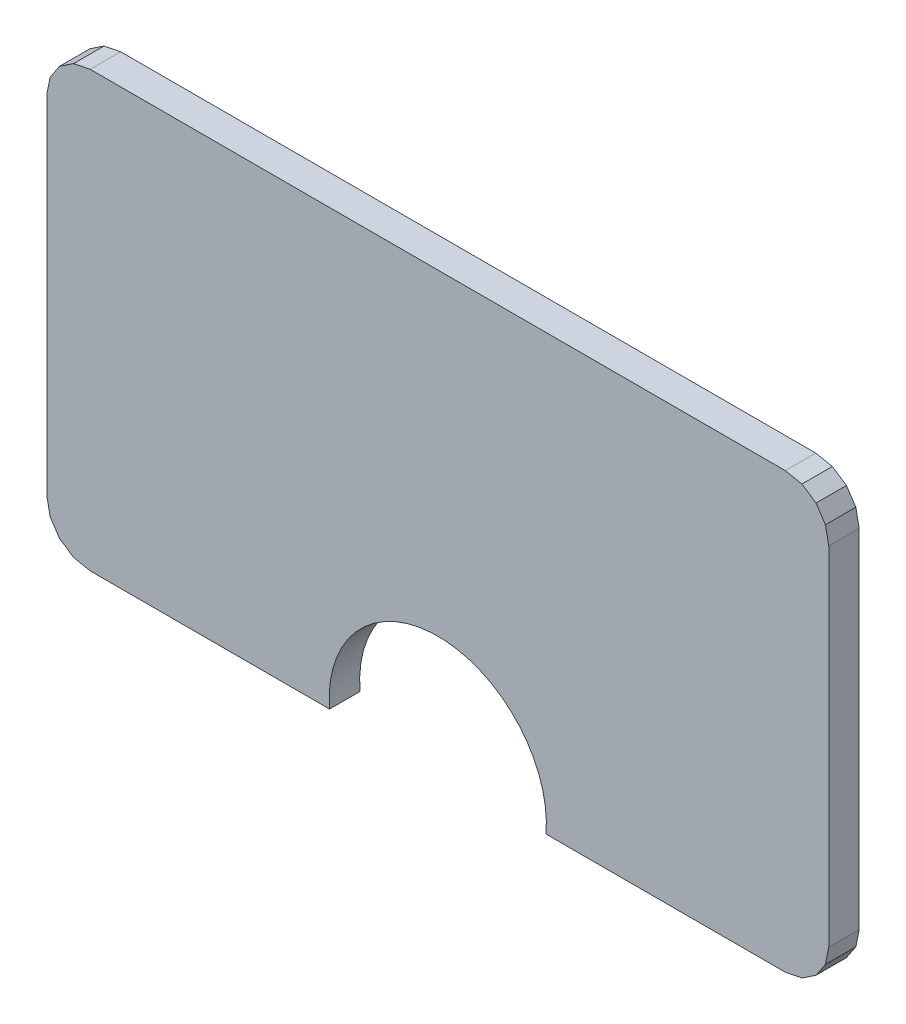
ISO-10303-21;
HEADER;
FILE_DESCRIPTION(('STEP AP214'),'2;1');
FILE_NAME('part.step','',(''),(''),'','','');
FILE_SCHEMA(('AUTOMOTIVE_DESIGN { 1 0 10303 214 1 1 1 1 }'));
ENDSEC;
DATA;
#1=APPLICATION_CONTEXT('core data for automotive mechanical design processes');
#2=APPLICATION_PROTOCOL_DEFINITION('international standard','automotive_design',2000,#1);
#3=PRODUCT_CONTEXT('',#1,'mechanical');
#4=PRODUCT('Part','Part','',(#3));
#5=PRODUCT_RELATED_PRODUCT_CATEGORY('part','',(#4));
#6=PRODUCT_DEFINITION_FORMATION('','',#4);
#7=PRODUCT_DEFINITION_CONTEXT('part definition',#1,'design');
#8=PRODUCT_DEFINITION('design','',#6,#7);
#9=PRODUCT_DEFINITION_SHAPE('','',#8);
#10=(LENGTH_UNIT() NAMED_UNIT(*) SI_UNIT(.MILLI.,.METRE.));
#11=(NAMED_UNIT(*) PLANE_ANGLE_UNIT() SI_UNIT($,.RADIAN.));
#12=(NAMED_UNIT(*) SI_UNIT($,.STERADIAN.) SOLID_ANGLE_UNIT());
#13=UNCERTAINTY_MEASURE_WITH_UNIT(LENGTH_MEASURE(1.E-05),#10,'distance_accuracy_value','');
#14=(GEOMETRIC_REPRESENTATION_CONTEXT(3) GLOBAL_UNCERTAINTY_ASSIGNED_CONTEXT((#13)) GLOBAL_UNIT_ASSIGNED_CONTEXT((#10,
#11,#12)) REPRESENTATION_CONTEXT('',''));
#15=CARTESIAN_POINT('',(0.,0.,0.));
#16=DIRECTION('',(0.,0.,1.));
#17=DIRECTION('',(1.,0.,0.));
#18=AXIS2_PLACEMENT_3D('',#15,#16,#17);
#19=CARTESIAN_POINT('',(81.68,-101.95,1.6));
#20=DIRECTION('',(1.,0.,0.));
#21=DIRECTION('',(0.,1.,0.));
#22=AXIS2_PLACEMENT_3D('',#19,#20,#21);
#23=PLANE('',#22);
#24=DIRECTION('',(0.,0.,1.));
#25=VECTOR('',#24,1.);
#26=CARTESIAN_POINT('',(81.68,-101.95,1.6));
#27=LINE('',#26,#25);
#28=CARTESIAN_POINT('',(81.68,-101.95,1.6));
#29=VERTEX_POINT('',#28);
#30=CARTESIAN_POINT('',(81.68,-101.95,1.635));
#31=VERTEX_POINT('',#30);
#32=EDGE_CURVE('E39',#29,#31,#27,.T.);
#33=ORIENTED_EDGE('',*,*,#32,.T.);
#34=DIRECTION('',(0.,-1.,0.));
#35=VECTOR('',#34,1.);
#36=CARTESIAN_POINT('',(81.68,-101.95,1.635));
#37=LINE('',#36,#35);
#38=CARTESIAN_POINT('',(81.68,-102.35,1.635));
#39=VERTEX_POINT('',#38);
#40=EDGE_CURVE('E266',#31,#39,#37,.T.);
#41=ORIENTED_EDGE('',*,*,#40,.T.);
#42=DIRECTION('',(0.,0.,1.));
#43=VECTOR('',#42,1.);
#44=CARTESIAN_POINT('',(81.68,-102.35,1.6));
#45=LINE('',#44,#43);
#46=CARTESIAN_POINT('',(81.68,-102.35,1.6));
#47=VERTEX_POINT('',#46);
#48=EDGE_CURVE('E11',#47,#39,#45,.T.);
#49=ORIENTED_EDGE('',*,*,#48,.F.);
#50=DIRECTION('',(0.,-1.,0.));
#51=VECTOR('',#50,1.);
#52=CARTESIAN_POINT('',(81.68,-101.95,1.6));
#53=LINE('',#52,#51);
#54=EDGE_CURVE('E400',#29,#47,#53,.T.);
#55=ORIENTED_EDGE('',*,*,#54,.F.);
#56=EDGE_LOOP('',(#33,#41,#49,#55));
#57=FACE_BOUND('',#56,.T.);
#58=ADVANCED_FACE('F17',(#57),#23,.T.);
#59=CARTESIAN_POINT('',(81.68,-102.35,1.6));
#60=DIRECTION('',(0.980785174844472,-0.195090852695094,0.));
#61=DIRECTION('',(0.,0.,-1.));
#62=AXIS2_PLACEMENT_3D('',#59,#60,#61);
#63=PLANE('',#62);
#64=ORIENTED_EDGE('',*,*,#48,.T.);
#65=DIRECTION('',(-0.195090852695094,-0.980785174844472,0.));
#66=VECTOR('',#65,1.);
#67=CARTESIAN_POINT('',(81.68,-102.35,1.635));
#68=LINE('',#67,#66);
#69=CARTESIAN_POINT('',(81.676194,-102.369134,1.635));
#70=VERTEX_POINT('',#69);
#71=EDGE_CURVE('E263',#39,#70,#68,.T.);
#72=ORIENTED_EDGE('',*,*,#71,.T.);
#73=DIRECTION('',(0.,0.,1.));
#74=VECTOR('',#73,1.);
#75=CARTESIAN_POINT('',(81.676194,-102.369134,1.6));
#76=LINE('',#75,#74);
#77=CARTESIAN_POINT('',(81.676194,-102.369134,1.6));
#78=VERTEX_POINT('',#77);
#79=EDGE_CURVE('E21',#78,#70,#76,.T.);
#80=ORIENTED_EDGE('',*,*,#79,.F.);
#81=DIRECTION('',(-0.195090852695094,-0.980785174844472,0.));
#82=VECTOR('',#81,1.);
#83=CARTESIAN_POINT('',(81.68,-102.35,1.6));
#84=LINE('',#83,#82);
#85=EDGE_CURVE('E385',#47,#78,#84,.T.);
#86=ORIENTED_EDGE('',*,*,#85,.F.);
#87=EDGE_LOOP('',(#64,#72,#80,#86));
#88=FACE_BOUND('',#87,.T.);
#89=ADVANCED_FACE('F19',(#88),#63,.T.);
#90=CARTESIAN_POINT('',(81.676194,-102.369134,1.6));
#91=DIRECTION('',(0.831458381235109,-0.555587041132073,0.));
#92=DIRECTION('',(0.,0.,-1.));
#93=AXIS2_PLACEMENT_3D('',#90,#91,#92);
#94=PLANE('',#93);
#95=ORIENTED_EDGE('',*,*,#79,.T.);
#96=DIRECTION('',(-0.555587041132073,-0.831458381235109,0.));
#97=VECTOR('',#96,1.);
#98=CARTESIAN_POINT('',(81.676194,-102.369134,1.635));
#99=LINE('',#98,#97);
#100=CARTESIAN_POINT('',(81.665355,-102.385355,1.635));
#101=VERTEX_POINT('',#100);
#102=EDGE_CURVE('E267',#70,#101,#99,.T.);
#103=ORIENTED_EDGE('',*,*,#102,.T.);
#104=DIRECTION('',(0.,0.,1.));
#105=VECTOR('',#104,1.);
#106=CARTESIAN_POINT('',(81.665355,-102.385355,1.6));
#107=LINE('',#106,#105);
#108=CARTESIAN_POINT('',(81.665355,-102.385355,1.6));
#109=VERTEX_POINT('',#108);
#110=EDGE_CURVE('E334',#109,#101,#107,.T.);
#111=ORIENTED_EDGE('',*,*,#110,.F.);
#112=DIRECTION('',(-0.555587041132073,-0.831458381235109,0.));
#113=VECTOR('',#112,1.);
#114=CARTESIAN_POINT('',(81.676194,-102.369134,1.6));
#115=LINE('',#114,#113);
#116=EDGE_CURVE('E380',#78,#109,#115,.T.);
#117=ORIENTED_EDGE('',*,*,#116,.F.);
#118=EDGE_LOOP('',(#95,#103,#111,#117));
#119=FACE_BOUND('',#118,.T.);
#120=ADVANCED_FACE('F517',(#119),#94,.T.);
#121=CARTESIAN_POINT('',(81.665355,-102.385355,1.6));
#122=DIRECTION('',(0.555587041132073,-0.831458381235109,0.));
#123=DIRECTION('',(0.,0.,-1.));
#124=AXIS2_PLACEMENT_3D('',#121,#122,#123);
#125=PLANE('',#124);
#126=ORIENTED_EDGE('',*,*,#110,.T.);
#127=DIRECTION('',(-0.831458381235109,-0.555587041132073,0.));
#128=VECTOR('',#127,1.);
#129=CARTESIAN_POINT('',(81.665355,-102.385355,1.635));
#130=LINE('',#129,#128);
#131=CARTESIAN_POINT('',(81.649134,-102.396194,1.635));
#132=VERTEX_POINT('',#131);
#133=EDGE_CURVE('E317',#101,#132,#130,.T.);
#134=ORIENTED_EDGE('',*,*,#133,.T.);
#135=DIRECTION('',(0.,0.,1.));
#136=VECTOR('',#135,1.);
#137=CARTESIAN_POINT('',(81.649134,-102.396194,1.6));
#138=LINE('',#137,#136);
#139=CARTESIAN_POINT('',(81.649134,-102.396194,1.6));
#140=VERTEX_POINT('',#139);
#141=EDGE_CURVE('E336',#140,#132,#138,.T.);
#142=ORIENTED_EDGE('',*,*,#141,.F.);
#143=DIRECTION('',(-0.831458381235109,-0.555587041132073,0.));
#144=VECTOR('',#143,1.);
#145=CARTESIAN_POINT('',(81.665355,-102.385355,1.6));
#146=LINE('',#145,#144);
#147=EDGE_CURVE('E384',#109,#140,#146,.T.);
#148=ORIENTED_EDGE('',*,*,#147,.F.);
#149=EDGE_LOOP('',(#126,#134,#142,#148));
#150=FACE_BOUND('',#149,.T.);
#151=ADVANCED_FACE('F515',(#150),#125,.T.);
#152=CARTESIAN_POINT('',(81.649134,-102.396194,1.6));
#153=DIRECTION('',(0.195090852695094,-0.980785174844472,0.));
#154=DIRECTION('',(0.,0.,-1.));
#155=AXIS2_PLACEMENT_3D('',#152,#153,#154);
#156=PLANE('',#155);
#157=ORIENTED_EDGE('',*,*,#141,.T.);
#158=DIRECTION('',(-0.980785174844472,-0.195090852695094,0.));
#159=VECTOR('',#158,1.);
#160=CARTESIAN_POINT('',(81.649134,-102.396194,1.635));
#161=LINE('',#160,#159);
#162=CARTESIAN_POINT('',(81.63,-102.4,1.635));
#163=VERTEX_POINT('',#162);
#164=EDGE_CURVE('E313',#132,#163,#161,.T.);
#165=ORIENTED_EDGE('',*,*,#164,.T.);
#166=DIRECTION('',(0.,0.,1.));
#167=VECTOR('',#166,1.);
#168=CARTESIAN_POINT('',(81.63,-102.4,1.6));
#169=LINE('',#168,#167);
#170=CARTESIAN_POINT('',(81.63,-102.4,1.6));
#171=VERTEX_POINT('',#170);
#172=EDGE_CURVE('E349',#171,#163,#169,.T.);
#173=ORIENTED_EDGE('',*,*,#172,.F.);
#174=DIRECTION('',(-0.980785174844472,-0.195090852695094,0.));
#175=VECTOR('',#174,1.);
#176=CARTESIAN_POINT('',(81.649134,-102.396194,1.6));
#177=LINE('',#176,#175);
#178=EDGE_CURVE('E419',#140,#171,#177,.T.);
#179=ORIENTED_EDGE('',*,*,#178,.F.);
#180=EDGE_LOOP('',(#157,#165,#173,#179));
#181=FACE_BOUND('',#180,.T.);
#182=ADVANCED_FACE('F511',(#181),#156,.T.);
#183=CARTESIAN_POINT('',(81.63,-102.4,1.6));
#184=DIRECTION('',(0.,-1.,0.));
#185=DIRECTION('',(0.,0.,-1.));
#186=AXIS2_PLACEMENT_3D('',#183,#184,#185);
#187=PLANE('',#186);
#188=DIRECTION('',(-1.,0.,0.));
#189=VECTOR('',#188,1.);
#190=CARTESIAN_POINT('',(81.63,-102.4,1.6));
#191=LINE('',#190,#189);
#192=CARTESIAN_POINT('',(81.35459935794,-102.4,1.6));
#193=VERTEX_POINT('',#192);
#194=EDGE_CURVE('E423',#171,#193,#191,.T.);
#195=ORIENTED_EDGE('',*,*,#194,.F.);
#196=ORIENTED_EDGE('',*,*,#172,.T.);
#197=DIRECTION('',(-1.,0.,0.));
#198=VECTOR('',#197,1.);
#199=CARTESIAN_POINT('',(81.63,-102.4,1.635));
#200=LINE('',#199,#198);
#201=CARTESIAN_POINT('',(81.35459935794,-102.4,1.635));
#202=VERTEX_POINT('',#201);
#203=EDGE_CURVE('E309',#163,#202,#200,.T.);
#204=ORIENTED_EDGE('',*,*,#203,.T.);
#205=DIRECTION('',(0.,0.,-1.));
#206=VECTOR('',#205,1.);
#207=CARTESIAN_POINT('',(81.354599357944,-102.4,-0.045));
#208=LINE('',#207,#206);
#209=EDGE_CURVE('E347',#202,#193,#208,.T.);
#210=ORIENTED_EDGE('',*,*,#209,.T.);
#211=EDGE_LOOP('',(#195,#196,#204,#210));
#212=FACE_BOUND('',#211,.T.);
#213=ADVANCED_FACE('F507',(#212),#187,.T.);
#214=CARTESIAN_POINT('',(81.23,-102.39,-0.045));
#215=DIRECTION('',(0.,0.,-1.));
#216=DIRECTION('',(0.,-1.,0.));
#217=AXIS2_PLACEMENT_3D('',#214,#215,#216);
#218=CYLINDRICAL_SURFACE('',#217,0.125);
#219=ORIENTED_EDGE('',*,*,#209,.F.);
#220=CARTESIAN_POINT('',(81.23,-102.39,1.635));
#221=DIRECTION('',(0.,0.,-1.));
#222=DIRECTION('',(0.,-1.,0.));
#223=AXIS2_PLACEMENT_3D('',#220,#221,#222);
#224=CIRCLE('',#223,0.125);
#225=CARTESIAN_POINT('',(81.10540064206,-102.4,1.635));
#226=VERTEX_POINT('',#225);
#227=EDGE_CURVE('E305',#226,#202,#224,.T.);
#228=ORIENTED_EDGE('',*,*,#227,.F.);
#229=DIRECTION('',(0.,0.,-1.));
#230=VECTOR('',#229,1.);
#231=CARTESIAN_POINT('',(81.105400642056,-102.4,-0.045));
#232=LINE('',#231,#230);
#233=CARTESIAN_POINT('',(81.10540064206,-102.4,1.6));
#234=VERTEX_POINT('',#233);
#235=EDGE_CURVE('E345',#226,#234,#232,.T.);
#236=ORIENTED_EDGE('',*,*,#235,.T.);
#237=CARTESIAN_POINT('',(81.23,-102.39,1.6));
#238=DIRECTION('',(0.,0.,-1.));
#239=DIRECTION('',(0.,-1.,0.));
#240=AXIS2_PLACEMENT_3D('',#237,#238,#239);
#241=CIRCLE('',#240,0.125);
#242=EDGE_CURVE('E427',#234,#193,#241,.T.);
#243=ORIENTED_EDGE('',*,*,#242,.T.);
#244=EDGE_LOOP('',(#219,#228,#236,#243));
#245=FACE_BOUND('',#244,.T.);
#246=ADVANCED_FACE('F506',(#245),#218,.F.);
#247=CARTESIAN_POINT('',(81.63,-102.4,1.6));
#248=DIRECTION('',(0.,-1.,0.));
#249=DIRECTION('',(0.,0.,-1.));
#250=AXIS2_PLACEMENT_3D('',#247,#248,#249);
#251=PLANE('',#250);
#252=DIRECTION('',(-1.,0.,0.));
#253=VECTOR('',#252,1.);
#254=CARTESIAN_POINT('',(81.63,-102.4,1.6));
#255=LINE('',#254,#253);
#256=CARTESIAN_POINT('',(80.83,-102.4,1.6));
#257=VERTEX_POINT('',#256);
#258=EDGE_CURVE('E430',#234,#257,#255,.T.);
#259=ORIENTED_EDGE('',*,*,#258,.F.);
#260=ORIENTED_EDGE('',*,*,#235,.F.);
#261=DIRECTION('',(-1.,0.,0.));
#262=VECTOR('',#261,1.);
#263=CARTESIAN_POINT('',(81.63,-102.4,1.635));
#264=LINE('',#263,#262);
#265=CARTESIAN_POINT('',(80.83,-102.4,1.635));
#266=VERTEX_POINT('',#265);
#267=EDGE_CURVE('E301',#226,#266,#264,.T.);
#268=ORIENTED_EDGE('',*,*,#267,.T.);
#269=DIRECTION('',(0.,0.,1.));
#270=VECTOR('',#269,1.);
#271=CARTESIAN_POINT('',(80.83,-102.4,1.6));
#272=LINE('',#271,#270);
#273=EDGE_CURVE('E342',#257,#266,#272,.T.);
#274=ORIENTED_EDGE('',*,*,#273,.F.);
#275=EDGE_LOOP('',(#259,#260,#268,#274));
#276=FACE_BOUND('',#275,.T.);
#277=ADVANCED_FACE('F504',(#276),#251,.T.);
#278=CARTESIAN_POINT('',(80.83,-102.4,1.6));
#279=DIRECTION('',(-0.195090852695094,-0.980785174844472,0.));
#280=DIRECTION('',(-0.980785174844472,0.195090852695094,0.));
#281=AXIS2_PLACEMENT_3D('',#278,#279,#280);
#282=PLANE('',#281);
#283=ORIENTED_EDGE('',*,*,#273,.T.);
#284=DIRECTION('',(-0.980785174844472,0.195090852695094,0.));
#285=VECTOR('',#284,1.);
#286=CARTESIAN_POINT('',(80.83,-102.4,1.635));
#287=LINE('',#286,#285);
#288=CARTESIAN_POINT('',(80.810866,-102.396194,1.635));
#289=VERTEX_POINT('',#288);
#290=EDGE_CURVE('E297',#266,#289,#287,.T.);
#291=ORIENTED_EDGE('',*,*,#290,.T.);
#292=DIRECTION('',(0.,0.,1.));
#293=VECTOR('',#292,1.);
#294=CARTESIAN_POINT('',(80.810866,-102.396194,1.6));
#295=LINE('',#294,#293);
#296=CARTESIAN_POINT('',(80.810866,-102.396194,1.6));
#297=VERTEX_POINT('',#296);
#298=EDGE_CURVE('E346',#297,#289,#295,.T.);
#299=ORIENTED_EDGE('',*,*,#298,.F.);
#300=DIRECTION('',(-0.980785174844472,0.195090852695094,0.));
#301=VECTOR('',#300,1.);
#302=CARTESIAN_POINT('',(80.83,-102.4,1.6));
#303=LINE('',#302,#301);
#304=EDGE_CURVE('E439',#257,#297,#303,.T.);
#305=ORIENTED_EDGE('',*,*,#304,.F.);
#306=EDGE_LOOP('',(#283,#291,#299,#305));
#307=FACE_BOUND('',#306,.T.);
#308=ADVANCED_FACE('F492',(#307),#282,.T.);
#309=CARTESIAN_POINT('',(80.810866,-102.396194,1.6));
#310=DIRECTION('',(-0.555587041132073,-0.831458381235109,0.));
#311=DIRECTION('',(-0.831458381235109,0.555587041132073,0.));
#312=AXIS2_PLACEMENT_3D('',#309,#310,#311);
#313=PLANE('',#312);
#314=ORIENTED_EDGE('',*,*,#298,.T.);
#315=DIRECTION('',(-0.831458381235109,0.555587041132073,0.));
#316=VECTOR('',#315,1.);
#317=CARTESIAN_POINT('',(80.810866,-102.396194,1.635));
#318=LINE('',#317,#316);
#319=CARTESIAN_POINT('',(80.794645,-102.385355,1.635));
#320=VERTEX_POINT('',#319);
#321=EDGE_CURVE('E293',#289,#320,#318,.T.);
#322=ORIENTED_EDGE('',*,*,#321,.T.);
#323=DIRECTION('',(0.,0.,1.));
#324=VECTOR('',#323,1.);
#325=CARTESIAN_POINT('',(80.794645,-102.385355,1.6));
#326=LINE('',#325,#324);
#327=CARTESIAN_POINT('',(80.794645,-102.385355,1.6));
#328=VERTEX_POINT('',#327);
#329=EDGE_CURVE('E379',#328,#320,#326,.T.);
#330=ORIENTED_EDGE('',*,*,#329,.F.);
#331=DIRECTION('',(-0.831458381235109,0.555587041132073,0.));
#332=VECTOR('',#331,1.);
#333=CARTESIAN_POINT('',(80.810866,-102.396194,1.6));
#334=LINE('',#333,#332);
#335=EDGE_CURVE('E440',#297,#328,#334,.T.);
#336=ORIENTED_EDGE('',*,*,#335,.F.);
#337=EDGE_LOOP('',(#314,#322,#330,#336));
#338=FACE_BOUND('',#337,.T.);
#339=ADVANCED_FACE('F496',(#338),#313,.T.);
#340=CARTESIAN_POINT('',(80.794645,-102.385355,1.6));
#341=DIRECTION('',(-0.831458381235109,-0.555587041132073,0.));
#342=DIRECTION('',(-0.555587041132073,0.831458381235109,0.));
#343=AXIS2_PLACEMENT_3D('',#340,#341,#342);
#344=PLANE('',#343);
#345=ORIENTED_EDGE('',*,*,#329,.T.);
#346=DIRECTION('',(-0.555587041132073,0.831458381235109,0.));
#347=VECTOR('',#346,1.);
#348=CARTESIAN_POINT('',(80.794645,-102.385355,1.635));
#349=LINE('',#348,#347);
#350=CARTESIAN_POINT('',(80.783806,-102.369134,1.635));
#351=VERTEX_POINT('',#350);
#352=EDGE_CURVE('E289',#320,#351,#349,.T.);
#353=ORIENTED_EDGE('',*,*,#352,.T.);
#354=DIRECTION('',(0.,0.,1.));
#355=VECTOR('',#354,1.);
#356=CARTESIAN_POINT('',(80.783806,-102.369134,1.6));
#357=LINE('',#356,#355);
#358=CARTESIAN_POINT('',(80.783806,-102.369134,1.6));
#359=VERTEX_POINT('',#358);
#360=EDGE_CURVE('E341',#359,#351,#357,.T.);
#361=ORIENTED_EDGE('',*,*,#360,.F.);
#362=DIRECTION('',(-0.555587041132073,0.831458381235109,0.));
#363=VECTOR('',#362,1.);
#364=CARTESIAN_POINT('',(80.794645,-102.385355,1.6));
#365=LINE('',#364,#363);
#366=EDGE_CURVE('E444',#328,#359,#365,.T.);
#367=ORIENTED_EDGE('',*,*,#366,.F.);
#368=EDGE_LOOP('',(#345,#353,#361,#367));
#369=FACE_BOUND('',#368,.T.);
#370=ADVANCED_FACE('F499',(#369),#344,.T.);
#371=CARTESIAN_POINT('',(80.783806,-102.369134,1.6));
#372=DIRECTION('',(-0.980785174844701,-0.19509085269394,0.));
#373=DIRECTION('',(-0.19509085269394,0.980785174844701,0.));
#374=AXIS2_PLACEMENT_3D('',#371,#372,#373);
#375=PLANE('',#374);
#376=ORIENTED_EDGE('',*,*,#360,.T.);
#377=DIRECTION('',(-0.19509085269394,0.980785174844701,0.));
#378=VECTOR('',#377,1.);
#379=CARTESIAN_POINT('',(80.783806,-102.369134,1.635));
#380=LINE('',#379,#378);
#381=CARTESIAN_POINT('',(80.78,-102.35,1.635));
#382=VERTEX_POINT('',#381);
#383=EDGE_CURVE('E285',#351,#382,#380,.T.);
#384=ORIENTED_EDGE('',*,*,#383,.T.);
#385=DIRECTION('',(0.,0.,1.));
#386=VECTOR('',#385,1.);
#387=CARTESIAN_POINT('',(80.78,-102.35,1.6));
#388=LINE('',#387,#386);
#389=CARTESIAN_POINT('',(80.78,-102.35,1.6));
#390=VERTEX_POINT('',#389);
#391=EDGE_CURVE('E338',#390,#382,#388,.T.);
#392=ORIENTED_EDGE('',*,*,#391,.F.);
#393=DIRECTION('',(-0.19509085269394,0.980785174844701,0.));
#394=VECTOR('',#393,1.);
#395=CARTESIAN_POINT('',(80.783806,-102.369134,1.6));
#396=LINE('',#395,#394);
#397=EDGE_CURVE('E251',#359,#390,#396,.T.);
#398=ORIENTED_EDGE('',*,*,#397,.F.);
#399=EDGE_LOOP('',(#376,#384,#392,#398));
#400=FACE_BOUND('',#399,.T.);
#401=ADVANCED_FACE('F453',(#400),#375,.T.);
#402=CARTESIAN_POINT('',(80.78,-102.35,1.6));
#403=DIRECTION('',(-1.,0.,0.));
#404=DIRECTION('',(0.,0.,1.));
#405=AXIS2_PLACEMENT_3D('',#402,#403,#404);
#406=PLANE('',#405);
#407=ORIENTED_EDGE('',*,*,#391,.T.);
#408=DIRECTION('',(0.,1.,0.));
#409=VECTOR('',#408,1.);
#410=CARTESIAN_POINT('',(80.78,-102.35,1.635));
#411=LINE('',#410,#409);
#412=CARTESIAN_POINT('',(80.78,-101.95,1.635));
#413=VERTEX_POINT('',#412);
#414=EDGE_CURVE('E281',#382,#413,#411,.T.);
#415=ORIENTED_EDGE('',*,*,#414,.T.);
#416=DIRECTION('',(0.,0.,1.));
#417=VECTOR('',#416,1.);
#418=CARTESIAN_POINT('',(80.78,-101.95,1.6));
#419=LINE('',#418,#417);
#420=CARTESIAN_POINT('',(80.78,-101.95,1.6));
#421=VERTEX_POINT('',#420);
#422=EDGE_CURVE('E229',#421,#413,#419,.T.);
#423=ORIENTED_EDGE('',*,*,#422,.F.);
#424=DIRECTION('',(0.,1.,0.));
#425=VECTOR('',#424,1.);
#426=CARTESIAN_POINT('',(80.78,-102.35,1.6));
#427=LINE('',#426,#425);
#428=EDGE_CURVE('E244',#390,#421,#427,.T.);
#429=ORIENTED_EDGE('',*,*,#428,.F.);
#430=EDGE_LOOP('',(#407,#415,#423,#429));
#431=FACE_BOUND('',#430,.T.);
#432=ADVANCED_FACE('F457',(#431),#406,.T.);
#433=CARTESIAN_POINT('',(80.78,-101.95,1.6));
#434=DIRECTION('',(-0.980785174844701,0.19509085269394,0.));
#435=DIRECTION('',(0.,0.,1.));
#436=AXIS2_PLACEMENT_3D('',#433,#434,#435);
#437=PLANE('',#436);
#438=ORIENTED_EDGE('',*,*,#422,.T.);
#439=DIRECTION('',(0.19509085269394,0.980785174844701,0.));
#440=VECTOR('',#439,1.);
#441=CARTESIAN_POINT('',(80.78,-101.95,1.635));
#442=LINE('',#441,#440);
#443=CARTESIAN_POINT('',(80.783806,-101.930866,1.635));
#444=VERTEX_POINT('',#443);
#445=EDGE_CURVE('E224',#413,#444,#442,.T.);
#446=ORIENTED_EDGE('',*,*,#445,.T.);
#447=DIRECTION('',(0.,0.,1.));
#448=VECTOR('',#447,1.);
#449=CARTESIAN_POINT('',(80.783806,-101.930866,1.6));
#450=LINE('',#449,#448);
#451=CARTESIAN_POINT('',(80.783806,-101.930866,1.6));
#452=VERTEX_POINT('',#451);
#453=EDGE_CURVE('E217',#452,#444,#450,.T.);
#454=ORIENTED_EDGE('',*,*,#453,.F.);
#455=DIRECTION('',(0.19509085269394,0.980785174844701,0.));
#456=VECTOR('',#455,1.);
#457=CARTESIAN_POINT('',(80.78,-101.95,1.6));
#458=LINE('',#457,#456);
#459=EDGE_CURVE('E221',#421,#452,#458,.T.);
#460=ORIENTED_EDGE('',*,*,#459,.F.);
#461=EDGE_LOOP('',(#438,#446,#454,#460));
#462=FACE_BOUND('',#461,.T.);
#463=ADVANCED_FACE('F219',(#462),#437,.T.);
#464=CARTESIAN_POINT('',(80.783806,-101.930866,1.6));
#465=DIRECTION('',(-0.831458381235109,0.555587041132073,0.));
#466=DIRECTION('',(0.,0.,1.));
#467=AXIS2_PLACEMENT_3D('',#464,#465,#466);
#468=PLANE('',#467);
#469=ORIENTED_EDGE('',*,*,#453,.T.);
#470=DIRECTION('',(0.555587041132073,0.831458381235109,0.));
#471=VECTOR('',#470,1.);
#472=CARTESIAN_POINT('',(80.783806,-101.930866,1.635));
#473=LINE('',#472,#471);
#474=CARTESIAN_POINT('',(80.794645,-101.914645,1.635));
#475=VERTEX_POINT('',#474);
#476=EDGE_CURVE('E276',#444,#475,#473,.T.);
#477=ORIENTED_EDGE('',*,*,#476,.T.);
#478=DIRECTION('',(0.,0.,1.));
#479=VECTOR('',#478,1.);
#480=CARTESIAN_POINT('',(80.794645,-101.914645,1.6));
#481=LINE('',#480,#479);
#482=CARTESIAN_POINT('',(80.794645,-101.914645,1.6));
#483=VERTEX_POINT('',#482);
#484=EDGE_CURVE('E230',#483,#475,#481,.T.);
#485=ORIENTED_EDGE('',*,*,#484,.F.);
#486=DIRECTION('',(0.555587041132073,0.831458381235109,0.));
#487=VECTOR('',#486,1.);
#488=CARTESIAN_POINT('',(80.783806,-101.930866,1.6));
#489=LINE('',#488,#487);
#490=EDGE_CURVE('E233',#452,#483,#489,.T.);
#491=ORIENTED_EDGE('',*,*,#490,.F.);
#492=EDGE_LOOP('',(#469,#477,#485,#491));
#493=FACE_BOUND('',#492,.T.);
#494=ADVANCED_FACE('F234',(#493),#468,.T.);
#495=CARTESIAN_POINT('',(80.794645,-101.914645,1.6));
#496=DIRECTION('',(-0.555587041132073,0.831458381235109,0.));
#497=DIRECTION('',(0.,0.,1.));
#498=AXIS2_PLACEMENT_3D('',#495,#496,#497);
#499=PLANE('',#498);
#500=ORIENTED_EDGE('',*,*,#484,.T.);
#501=DIRECTION('',(0.831458381235109,0.555587041132073,0.));
#502=VECTOR('',#501,1.);
#503=CARTESIAN_POINT('',(80.794645,-101.914645,1.635));
#504=LINE('',#503,#502);
#505=CARTESIAN_POINT('',(80.810866,-101.903806,1.635));
#506=VERTEX_POINT('',#505);
#507=EDGE_CURVE('E272',#475,#506,#504,.T.);
#508=ORIENTED_EDGE('',*,*,#507,.T.);
#509=DIRECTION('',(0.,0.,1.));
#510=VECTOR('',#509,1.);
#511=CARTESIAN_POINT('',(80.810866,-101.903806,1.6));
#512=LINE('',#511,#510);
#513=CARTESIAN_POINT('',(80.810866,-101.903806,1.6));
#514=VERTEX_POINT('',#513);
#515=EDGE_CURVE('E329',#514,#506,#512,.T.);
#516=ORIENTED_EDGE('',*,*,#515,.F.);
#517=DIRECTION('',(0.831458381235109,0.555587041132073,0.));
#518=VECTOR('',#517,1.);
#519=CARTESIAN_POINT('',(80.794645,-101.914645,1.6));
#520=LINE('',#519,#518);
#521=EDGE_CURVE('E239',#483,#514,#520,.T.);
#522=ORIENTED_EDGE('',*,*,#521,.F.);
#523=EDGE_LOOP('',(#500,#508,#516,#522));
#524=FACE_BOUND('',#523,.T.);
#525=ADVANCED_FACE('F464',(#524),#499,.T.);
#526=CARTESIAN_POINT('',(80.810866,-101.903806,1.6));
#527=DIRECTION('',(-0.195090852694903,0.98078517484451,0.));
#528=DIRECTION('',(0.,0.,1.));
#529=AXIS2_PLACEMENT_3D('',#526,#527,#528);
#530=PLANE('',#529);
#531=ORIENTED_EDGE('',*,*,#515,.T.);
#532=DIRECTION('',(0.98078517484451,0.195090852694903,0.));
#533=VECTOR('',#532,1.);
#534=CARTESIAN_POINT('',(80.810866,-101.903806,1.635));
#535=LINE('',#534,#533);
#536=CARTESIAN_POINT('',(80.83,-101.9,1.635));
#537=VERTEX_POINT('',#536);
#538=EDGE_CURVE('E268',#506,#537,#535,.T.);
#539=ORIENTED_EDGE('',*,*,#538,.T.);
#540=DIRECTION('',(0.,0.,1.));
#541=VECTOR('',#540,1.);
#542=CARTESIAN_POINT('',(80.83,-101.9,1.6));
#543=LINE('',#542,#541);
#544=CARTESIAN_POINT('',(80.83,-101.9,1.6));
#545=VERTEX_POINT('',#544);
#546=EDGE_CURVE('E324',#545,#537,#543,.T.);
#547=ORIENTED_EDGE('',*,*,#546,.F.);
#548=DIRECTION('',(0.98078517484451,0.195090852694903,0.));
#549=VECTOR('',#548,1.);
#550=CARTESIAN_POINT('',(80.810866,-101.903806,1.6));
#551=LINE('',#550,#549);
#552=EDGE_CURVE('E255',#514,#545,#551,.T.);
#553=ORIENTED_EDGE('',*,*,#552,.F.);
#554=EDGE_LOOP('',(#531,#539,#547,#553));
#555=FACE_BOUND('',#554,.T.);
#556=ADVANCED_FACE('F544',(#555),#530,.T.);
#557=CARTESIAN_POINT('',(81.676194,-101.930866,1.6));
#558=DIRECTION('',(0.980785174844472,0.195090852695094,0.));
#559=DIRECTION('',(0.,0.,-1.));
#560=AXIS2_PLACEMENT_3D('',#557,#558,#559);
#561=PLANE('',#560);
#562=DIRECTION('',(0.,0.,1.));
#563=VECTOR('',#562,1.);
#564=CARTESIAN_POINT('',(81.676194,-101.930866,1.6));
#565=LINE('',#564,#563);
#566=CARTESIAN_POINT('',(81.676194,-101.930866,1.6));
#567=VERTEX_POINT('',#566);
#568=CARTESIAN_POINT('',(81.676194,-101.930866,1.635));
#569=VERTEX_POINT('',#568);
#570=EDGE_CURVE('E395',#567,#569,#565,.T.);
#571=ORIENTED_EDGE('',*,*,#570,.T.);
#572=DIRECTION('',(0.195090852695094,-0.980785174844472,0.));
#573=VECTOR('',#572,1.);
#574=CARTESIAN_POINT('',(81.676194,-101.930866,1.635));
#575=LINE('',#574,#573);
#576=EDGE_CURVE('E323',#569,#31,#575,.T.);
#577=ORIENTED_EDGE('',*,*,#576,.T.);
#578=ORIENTED_EDGE('',*,*,#32,.F.);
#579=DIRECTION('',(0.195090852695094,-0.980785174844472,0.));
#580=VECTOR('',#579,1.);
#581=CARTESIAN_POINT('',(81.676194,-101.930866,1.6));
#582=LINE('',#581,#580);
#583=EDGE_CURVE('E396',#567,#29,#582,.T.);
#584=ORIENTED_EDGE('',*,*,#583,.F.);
#585=EDGE_LOOP('',(#571,#577,#578,#584));
#586=FACE_BOUND('',#585,.T.);
#587=ADVANCED_FACE('F540',(#586),#561,.T.);
#588=CARTESIAN_POINT('',(80.83,-101.9,1.6));
#589=DIRECTION('',(0.,1.,0.));
#590=DIRECTION('',(1.,0.,0.));
#591=AXIS2_PLACEMENT_3D('',#588,#589,#590);
#592=PLANE('',#591);
#593=ORIENTED_EDGE('',*,*,#546,.T.);
#594=DIRECTION('',(1.,0.,0.));
#595=VECTOR('',#594,1.);
#596=CARTESIAN_POINT('',(80.83,-101.9,1.635));
#597=LINE('',#596,#595);
#598=CARTESIAN_POINT('',(81.63,-101.9,1.635));
#599=VERTEX_POINT('',#598);
#600=EDGE_CURVE('E262',#537,#599,#597,.T.);
#601=ORIENTED_EDGE('',*,*,#600,.T.);
#602=DIRECTION('',(0.,0.,1.));
#603=VECTOR('',#602,1.);
#604=CARTESIAN_POINT('',(81.63,-101.9,1.6));
#605=LINE('',#604,#603);
#606=CARTESIAN_POINT('',(81.63,-101.9,1.6));
#607=VERTEX_POINT('',#606);
#608=EDGE_CURVE('E368',#607,#599,#605,.T.);
#609=ORIENTED_EDGE('',*,*,#608,.F.);
#610=DIRECTION('',(1.,0.,0.));
#611=VECTOR('',#610,1.);
#612=CARTESIAN_POINT('',(80.83,-101.9,1.6));
#613=LINE('',#612,#611);
#614=EDGE_CURVE('E259',#545,#607,#613,.T.);
#615=ORIENTED_EDGE('',*,*,#614,.F.);
#616=EDGE_LOOP('',(#593,#601,#609,#615));
#617=FACE_BOUND('',#616,.T.);
#618=ADVANCED_FACE('F537',(#617),#592,.T.);
#619=CARTESIAN_POINT('',(81.23,-102.15,1.635));
#620=DIRECTION('',(0.,0.,-1.));
#621=DIRECTION('',(0.,-1.,0.));
#622=AXIS2_PLACEMENT_3D('',#619,#620,#621);
#623=PLANE('',#622);
#624=ORIENTED_EDGE('',*,*,#600,.F.);
#625=ORIENTED_EDGE('',*,*,#538,.F.);
#626=ORIENTED_EDGE('',*,*,#507,.F.);
#627=ORIENTED_EDGE('',*,*,#476,.F.);
#628=ORIENTED_EDGE('',*,*,#445,.F.);
#629=ORIENTED_EDGE('',*,*,#414,.F.);
#630=ORIENTED_EDGE('',*,*,#383,.F.);
#631=ORIENTED_EDGE('',*,*,#352,.F.);
#632=ORIENTED_EDGE('',*,*,#321,.F.);
#633=ORIENTED_EDGE('',*,*,#290,.F.);
#634=ORIENTED_EDGE('',*,*,#267,.F.);
#635=ORIENTED_EDGE('',*,*,#227,.T.);
#636=ORIENTED_EDGE('',*,*,#203,.F.);
#637=ORIENTED_EDGE('',*,*,#164,.F.);
#638=ORIENTED_EDGE('',*,*,#133,.F.);
#639=ORIENTED_EDGE('',*,*,#102,.F.);
#640=ORIENTED_EDGE('',*,*,#71,.F.);
#641=ORIENTED_EDGE('',*,*,#40,.F.);
#642=ORIENTED_EDGE('',*,*,#576,.F.);
#643=DIRECTION('',(0.555587041132073,-0.831458381235109,0.));
#644=VECTOR('',#643,1.);
#645=CARTESIAN_POINT('',(81.665355,-101.914645,1.635));
#646=LINE('',#645,#644);
#647=CARTESIAN_POINT('',(81.665355,-101.914645,1.635));
#648=VERTEX_POINT('',#647);
#649=EDGE_CURVE('E391',#648,#569,#646,.T.);
#650=ORIENTED_EDGE('',*,*,#649,.F.);
#651=DIRECTION('',(0.831458381235109,-0.555587041132073,0.));
#652=VECTOR('',#651,1.);
#653=CARTESIAN_POINT('',(81.649134,-101.903806,1.635));
#654=LINE('',#653,#652);
#655=CARTESIAN_POINT('',(81.649134,-101.903806,1.635));
#656=VERTEX_POINT('',#655);
#657=EDGE_CURVE('E476',#656,#648,#654,.T.);
#658=ORIENTED_EDGE('',*,*,#657,.F.);
#659=DIRECTION('',(0.980785174844701,-0.19509085269394,0.));
#660=VECTOR('',#659,1.);
#661=CARTESIAN_POINT('',(81.63,-101.9,1.635));
#662=LINE('',#661,#660);
#663=EDGE_CURVE('E372',#599,#656,#662,.T.);
#664=ORIENTED_EDGE('',*,*,#663,.F.);
#665=EDGE_LOOP('',(#624,#625,#626,#627,#628,#629,#630,#631,#632,#633,#634,#635,#636,#637,#638,
#639,#640,#641,#642,#650,#658,#664));
#666=FACE_BOUND('',#665,.T.);
#667=ADVANCED_FACE('F460',(#666),#623,.F.);
#668=CARTESIAN_POINT('',(81.23,-102.15,1.6));
#669=DIRECTION('',(0.,0.,-1.));
#670=DIRECTION('',(0.,-1.,0.));
#671=AXIS2_PLACEMENT_3D('',#668,#669,#670);
#672=PLANE('',#671);
#673=DIRECTION('',(0.980785174844701,-0.19509085269394,0.));
#674=VECTOR('',#673,1.);
#675=CARTESIAN_POINT('',(81.63,-101.9,1.6));
#676=LINE('',#675,#674);
#677=CARTESIAN_POINT('',(81.649134,-101.903806,1.6));
#678=VERTEX_POINT('',#677);
#679=EDGE_CURVE('E388',#607,#678,#676,.T.);
#680=ORIENTED_EDGE('',*,*,#679,.T.);
#681=DIRECTION('',(0.831458381235109,-0.555587041132073,0.));
#682=VECTOR('',#681,1.);
#683=CARTESIAN_POINT('',(81.649134,-101.903806,1.6));
#684=LINE('',#683,#682);
#685=CARTESIAN_POINT('',(81.665355,-101.914645,1.6));
#686=VERTEX_POINT('',#685);
#687=EDGE_CURVE('E373',#678,#686,#684,.T.);
#688=ORIENTED_EDGE('',*,*,#687,.T.);
#689=DIRECTION('',(0.555587041132073,-0.831458381235109,0.));
#690=VECTOR('',#689,1.);
#691=CARTESIAN_POINT('',(81.665355,-101.914645,1.6));
#692=LINE('',#691,#690);
#693=EDGE_CURVE('E401',#686,#567,#692,.T.);
#694=ORIENTED_EDGE('',*,*,#693,.T.);
#695=ORIENTED_EDGE('',*,*,#583,.T.);
#696=ORIENTED_EDGE('',*,*,#54,.T.);
#697=ORIENTED_EDGE('',*,*,#85,.T.);
#698=ORIENTED_EDGE('',*,*,#116,.T.);
#699=ORIENTED_EDGE('',*,*,#147,.T.);
#700=ORIENTED_EDGE('',*,*,#178,.T.);
#701=ORIENTED_EDGE('',*,*,#194,.T.);
#702=ORIENTED_EDGE('',*,*,#242,.F.);
#703=ORIENTED_EDGE('',*,*,#258,.T.);
#704=ORIENTED_EDGE('',*,*,#304,.T.);
#705=ORIENTED_EDGE('',*,*,#335,.T.);
#706=ORIENTED_EDGE('',*,*,#366,.T.);
#707=ORIENTED_EDGE('',*,*,#397,.T.);
#708=ORIENTED_EDGE('',*,*,#428,.T.);
#709=ORIENTED_EDGE('',*,*,#459,.T.);
#710=ORIENTED_EDGE('',*,*,#490,.T.);
#711=ORIENTED_EDGE('',*,*,#521,.T.);
#712=ORIENTED_EDGE('',*,*,#552,.T.);
#713=ORIENTED_EDGE('',*,*,#614,.T.);
#714=EDGE_LOOP('',(#680,#688,#694,#695,#696,#697,#698,#699,#700,#701,#702,#703,#704,#705,#706,
#707,#708,#709,#710,#711,#712,#713));
#715=FACE_BOUND('',#714,.T.);
#716=ADVANCED_FACE('F241',(#715),#672,.T.);
#717=CARTESIAN_POINT('',(81.665355,-101.914645,1.6));
#718=DIRECTION('',(0.831458381235109,0.555587041132073,0.));
#719=DIRECTION('',(0.,0.,-1.));
#720=AXIS2_PLACEMENT_3D('',#717,#718,#719);
#721=PLANE('',#720);
#722=DIRECTION('',(0.,0.,1.));
#723=VECTOR('',#722,1.);
#724=CARTESIAN_POINT('',(81.665355,-101.914645,1.6));
#725=LINE('',#724,#723);
#726=EDGE_CURVE('E364',#686,#648,#725,.T.);
#727=ORIENTED_EDGE('',*,*,#726,.T.);
#728=ORIENTED_EDGE('',*,*,#649,.T.);
#729=ORIENTED_EDGE('',*,*,#570,.F.);
#730=ORIENTED_EDGE('',*,*,#693,.F.);
#731=EDGE_LOOP('',(#727,#728,#729,#730));
#732=FACE_BOUND('',#731,.T.);
#733=ADVANCED_FACE('F667',(#732),#721,.T.);
#734=CARTESIAN_POINT('',(81.63,-101.9,1.6));
#735=DIRECTION('',(0.19509085269394,0.980785174844701,0.));
#736=DIRECTION('',(0.,0.,-1.));
#737=AXIS2_PLACEMENT_3D('',#734,#735,#736);
#738=PLANE('',#737);
#739=ORIENTED_EDGE('',*,*,#608,.T.);
#740=ORIENTED_EDGE('',*,*,#663,.T.);
#741=DIRECTION('',(0.,0.,1.));
#742=VECTOR('',#741,1.);
#743=CARTESIAN_POINT('',(81.649134,-101.903806,1.6));
#744=LINE('',#743,#742);
#745=EDGE_CURVE('E472',#678,#656,#744,.T.);
#746=ORIENTED_EDGE('',*,*,#745,.F.);
#747=ORIENTED_EDGE('',*,*,#679,.F.);
#748=EDGE_LOOP('',(#739,#740,#746,#747));
#749=FACE_BOUND('',#748,.T.);
#750=ADVANCED_FACE('F674',(#749),#738,.T.);
#751=CARTESIAN_POINT('',(81.649134,-101.903806,1.6));
#752=DIRECTION('',(0.555587041132073,0.831458381235109,0.));
#753=DIRECTION('',(0.,0.,-1.));
#754=AXIS2_PLACEMENT_3D('',#751,#752,#753);
#755=PLANE('',#754);
#756=ORIENTED_EDGE('',*,*,#745,.T.);
#757=ORIENTED_EDGE('',*,*,#657,.T.);
#758=ORIENTED_EDGE('',*,*,#726,.F.);
#759=ORIENTED_EDGE('',*,*,#687,.F.);
#760=EDGE_LOOP('',(#756,#757,#758,#759));
#761=FACE_BOUND('',#760,.T.);
#762=ADVANCED_FACE('F683',(#761),#755,.T.);
#763=CLOSED_SHELL('',(#58,#89,#120,#151,#182,#213,#246,#277,#308,#339,#370,#401,#432,#463,#494,
#525,#556,#587,#618,#667,#716,#733,#750,#762));
#764=MANIFOLD_SOLID_BREP('B1',#763);
#765=ADVANCED_BREP_SHAPE_REPRESENTATION('',(#18,#764),#14);
#766=SHAPE_DEFINITION_REPRESENTATION(#9,#765);
ENDSEC;
END-ISO-10303-21;
